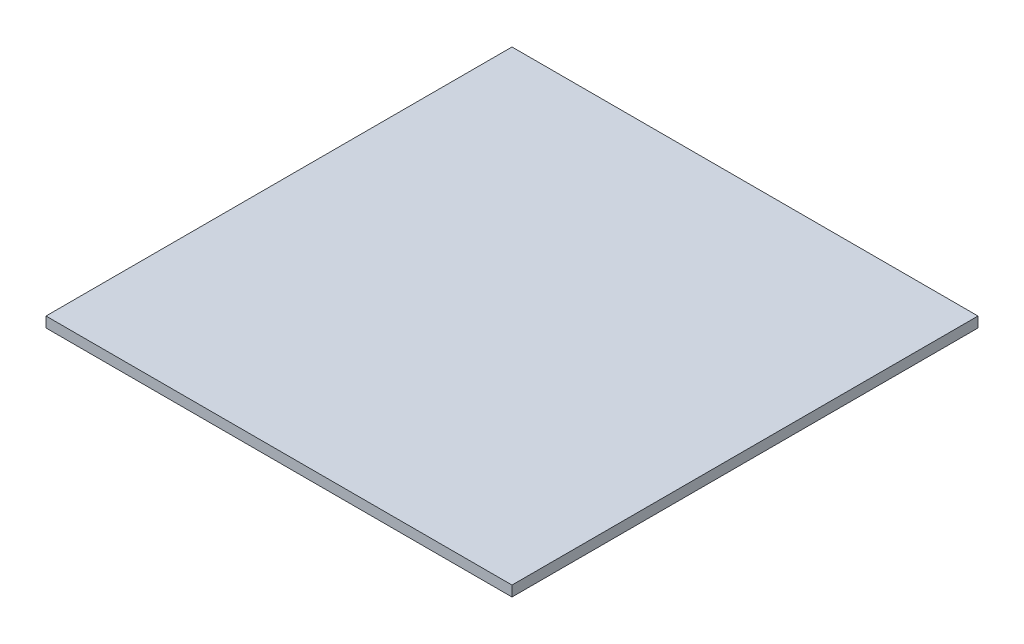
ISO-10303-21;
HEADER;
FILE_DESCRIPTION(('STEP AP214'),'2;1');
FILE_NAME('part.step','',(''),(''),'','','');
FILE_SCHEMA(('AUTOMOTIVE_DESIGN { 1 0 10303 214 1 1 1 1 }'));
ENDSEC;
DATA;
#1=APPLICATION_CONTEXT('core data for automotive mechanical design processes');
#2=APPLICATION_PROTOCOL_DEFINITION('international standard','automotive_design',2000,#1);
#3=PRODUCT_CONTEXT('',#1,'mechanical');
#4=PRODUCT('Part','Part','',(#3));
#5=PRODUCT_RELATED_PRODUCT_CATEGORY('part','',(#4));
#6=PRODUCT_DEFINITION_FORMATION('','',#4);
#7=PRODUCT_DEFINITION_CONTEXT('part definition',#1,'design');
#8=PRODUCT_DEFINITION('design','',#6,#7);
#9=PRODUCT_DEFINITION_SHAPE('','',#8);
#10=(LENGTH_UNIT() NAMED_UNIT(*) SI_UNIT(.MILLI.,.METRE.));
#11=(NAMED_UNIT(*) PLANE_ANGLE_UNIT() SI_UNIT($,.RADIAN.));
#12=(NAMED_UNIT(*) SI_UNIT($,.STERADIAN.) SOLID_ANGLE_UNIT());
#13=UNCERTAINTY_MEASURE_WITH_UNIT(LENGTH_MEASURE(1.E-05),#10,'distance_accuracy_value','');
#14=(GEOMETRIC_REPRESENTATION_CONTEXT(3) GLOBAL_UNCERTAINTY_ASSIGNED_CONTEXT((#13)) GLOBAL_UNIT_ASSIGNED_CONTEXT((#10,
#11,#12)) REPRESENTATION_CONTEXT('',''));
#15=CARTESIAN_POINT('',(0.,0.,0.));
#16=DIRECTION('',(0.,0.,1.));
#17=DIRECTION('',(1.,0.,0.));
#18=AXIS2_PLACEMENT_3D('',#15,#16,#17);
#19=CARTESIAN_POINT('',(-325.,0.,-325.));
#20=DIRECTION('',(0.,1.,0.));
#21=DIRECTION('',(1.,0.,0.));
#22=AXIS2_PLACEMENT_3D('',#19,#20,#21);
#23=PLANE('',#22);
#24=DIRECTION('',(-1.,0.,0.));
#25=VECTOR('',#24,1.);
#26=CARTESIAN_POINT('',(-162.5,0.,-650.));
#27=LINE('',#26,#25);
#28=CARTESIAN_POINT('',(0.,0.,-650.));
#29=VERTEX_POINT('',#28);
#30=CARTESIAN_POINT('',(-650.,0.,-650.));
#31=VERTEX_POINT('',#30);
#32=EDGE_CURVE('E342',#29,#31,#27,.T.);
#33=ORIENTED_EDGE('',*,*,#32,.F.);
#34=DIRECTION('',(0.,0.,-1.));
#35=VECTOR('',#34,1.);
#36=CARTESIAN_POINT('',(0.,0.,-162.5));
#37=LINE('',#36,#35);
#38=CARTESIAN_POINT('',(0.,0.,0.));
#39=VERTEX_POINT('',#38);
#40=EDGE_CURVE('E38',#39,#29,#37,.T.);
#41=ORIENTED_EDGE('',*,*,#40,.F.);
#42=DIRECTION('',(1.,0.,0.));
#43=VECTOR('',#42,1.);
#44=CARTESIAN_POINT('',(-487.5,0.,0.));
#45=LINE('',#44,#43);
#46=CARTESIAN_POINT('',(-650.,0.,0.));
#47=VERTEX_POINT('',#46);
#48=EDGE_CURVE('E424',#47,#39,#45,.T.);
#49=ORIENTED_EDGE('',*,*,#48,.F.);
#50=DIRECTION('',(0.,0.,1.));
#51=VECTOR('',#50,1.);
#52=CARTESIAN_POINT('',(-650.,0.,-487.5));
#53=LINE('',#52,#51);
#54=EDGE_CURVE('E352',#31,#47,#53,.T.);
#55=ORIENTED_EDGE('',*,*,#54,.F.);
#56=EDGE_LOOP('',(#33,#41,#49,#55));
#57=FACE_BOUND('',#56,.T.);
#58=DIRECTION('',(-1.,0.,0.));
#59=VECTOR('',#58,1.);
#60=CARTESIAN_POINT('',(-397.5,0.,-180.));
#61=LINE('',#60,#59);
#62=CARTESIAN_POINT('',(-430.,0.,-180.));
#63=VERTEX_POINT('',#62);
#64=CARTESIAN_POINT('',(-470.,0.,-180.));
#65=VERTEX_POINT('',#64);
#66=EDGE_CURVE('E369',#63,#65,#61,.T.);
#67=ORIENTED_EDGE('',*,*,#66,.F.);
#68=DIRECTION('',(0.,0.,1.));
#69=VECTOR('',#68,1.);
#70=CARTESIAN_POINT('',(-430.,0.,-252.5));
#71=LINE('',#70,#69);
#72=CARTESIAN_POINT('',(-430.,0.,-220.));
#73=VERTEX_POINT('',#72);
#74=EDGE_CURVE('E363',#73,#63,#71,.T.);
#75=ORIENTED_EDGE('',*,*,#74,.F.);
#76=DIRECTION('',(1.,0.,0.));
#77=VECTOR('',#76,1.);
#78=CARTESIAN_POINT('',(-377.5,0.,-220.));
#79=LINE('',#78,#77);
#80=CARTESIAN_POINT('',(-470.,0.,-220.));
#81=VERTEX_POINT('',#80);
#82=EDGE_CURVE('E321',#81,#73,#79,.T.);
#83=ORIENTED_EDGE('',*,*,#82,.F.);
#84=DIRECTION('',(0.,0.,-1.));
#85=VECTOR('',#84,1.);
#86=CARTESIAN_POINT('',(-470.,0.,-272.5));
#87=LINE('',#86,#85);
#88=EDGE_CURVE('E279',#65,#81,#87,.T.);
#89=ORIENTED_EDGE('',*,*,#88,.F.);
#90=EDGE_LOOP('',(#67,#75,#83,#89));
#91=FACE_BOUND('',#90,.T.);
#92=DIRECTION('',(0.,0.,1.));
#93=VECTOR('',#92,1.);
#94=CARTESIAN_POINT('',(-270.,0.,-325.));
#95=LINE('',#94,#93);
#96=CARTESIAN_POINT('',(-270.,0.,-330.95));
#97=VERTEX_POINT('',#96);
#98=CARTESIAN_POINT('',(-270.,0.,-319.05));
#99=VERTEX_POINT('',#98);
#100=EDGE_CURVE('E367',#97,#99,#95,.T.);
#101=ORIENTED_EDGE('',*,*,#100,.F.);
#102=DIRECTION('',(-1.,0.,0.));
#103=VECTOR('',#102,1.);
#104=CARTESIAN_POINT('',(-325.,0.,-330.95));
#105=LINE('',#104,#103);
#106=CARTESIAN_POINT('',(-370.,0.,-330.95));
#107=VERTEX_POINT('',#106);
#108=EDGE_CURVE('E10',#97,#107,#105,.T.);
#109=ORIENTED_EDGE('',*,*,#108,.T.);
#110=DIRECTION('',(0.,0.,-1.));
#111=VECTOR('',#110,1.);
#112=CARTESIAN_POINT('',(-370.,0.,-325.));
#113=LINE('',#112,#111);
#114=CARTESIAN_POINT('',(-370.,0.,-319.05));
#115=VERTEX_POINT('',#114);
#116=EDGE_CURVE('E285',#115,#107,#113,.T.);
#117=ORIENTED_EDGE('',*,*,#116,.F.);
#118=DIRECTION('',(1.,0.,0.));
#119=VECTOR('',#118,1.);
#120=CARTESIAN_POINT('',(-325.,0.,-319.05));
#121=LINE('',#120,#119);
#122=EDGE_CURVE('E25',#115,#99,#121,.T.);
#123=ORIENTED_EDGE('',*,*,#122,.T.);
#124=EDGE_LOOP('',(#101,#109,#117,#123));
#125=FACE_BOUND('',#124,.T.);
#126=DIRECTION('',(-0.707106781186548,0.,-0.707106781186548));
#127=VECTOR('',#126,1.);
#128=CARTESIAN_POINT('',(-580.557539631927,0.,-69.4424603680731));
#129=LINE('',#128,#127);
#130=CARTESIAN_POINT('',(-576.350254283867,0.,-65.2351750200131));
#131=VERTEX_POINT('',#130);
#132=CARTESIAN_POINT('',(-584.764824979987,0.,-73.649745716133));
#133=VERTEX_POINT('',#132);
#134=EDGE_CURVE('E442',#131,#133,#129,.T.);
#135=ORIENTED_EDGE('',*,*,#134,.F.);
#136=DIRECTION('',(0.707106781186548,0.,-0.707106781186548));
#137=VECTOR('',#136,1.);
#138=CARTESIAN_POINT('',(-537.459381318607,0.,-104.126047985273));
#139=LINE('',#138,#137);
#140=CARTESIAN_POINT('',(-505.639576165212,0.,-135.945853138668));
#141=VERTEX_POINT('',#140);
#142=EDGE_CURVE('E350',#131,#141,#139,.T.);
#143=ORIENTED_EDGE('',*,*,#142,.T.);
#144=DIRECTION('',(0.707106781186548,0.,0.707106781186548));
#145=VECTOR('',#144,1.);
#146=CARTESIAN_POINT('',(-509.846861513272,0.,-140.153138486728));
#147=LINE('',#146,#145);
#148=CARTESIAN_POINT('',(-514.054146861332,0.,-144.360423834788));
#149=VERTEX_POINT('',#148);
#150=EDGE_CURVE('E299',#149,#141,#147,.T.);
#151=ORIENTED_EDGE('',*,*,#150,.F.);
#152=DIRECTION('',(-0.707106781186548,0.,0.707106781186548));
#153=VECTOR('',#152,1.);
#154=CARTESIAN_POINT('',(-545.873952014727,0.,-112.540618681393));
#155=LINE('',#154,#153);
#156=EDGE_CURVE('E338',#149,#133,#155,.T.);
#157=ORIENTED_EDGE('',*,*,#156,.T.);
#158=EDGE_LOOP('',(#135,#143,#151,#157));
#159=FACE_BOUND('',#158,.T.);
#160=DIRECTION('',(-1.,0.,0.));
#161=VECTOR('',#160,1.);
#162=CARTESIAN_POINT('',(-325.,0.,-53.3333333333333));
#163=LINE('',#162,#161);
#164=CARTESIAN_POINT('',(-319.05,0.,-53.3333333333334));
#165=VERTEX_POINT('',#164);
#166=CARTESIAN_POINT('',(-330.95,0.,-53.3333333333334));
#167=VERTEX_POINT('',#166);
#168=EDGE_CURVE('E446',#165,#167,#163,.T.);
#169=ORIENTED_EDGE('',*,*,#168,.F.);
#170=DIRECTION('',(0.,0.,-1.));
#171=VECTOR('',#170,1.);
#172=CARTESIAN_POINT('',(-319.05,0.,-108.333333333333));
#173=LINE('',#172,#171);
#174=CARTESIAN_POINT('',(-319.05,0.,-153.333333333333));
#175=VERTEX_POINT('',#174);
#176=EDGE_CURVE('E334',#165,#175,#173,.T.);
#177=ORIENTED_EDGE('',*,*,#176,.T.);
#178=DIRECTION('',(1.,0.,0.));
#179=VECTOR('',#178,1.);
#180=CARTESIAN_POINT('',(-325.,0.,-153.333333333333));
#181=LINE('',#180,#179);
#182=CARTESIAN_POINT('',(-330.95,0.,-153.333333333333));
#183=VERTEX_POINT('',#182);
#184=EDGE_CURVE('E313',#183,#175,#181,.T.);
#185=ORIENTED_EDGE('',*,*,#184,.F.);
#186=DIRECTION('',(0.,0.,1.));
#187=VECTOR('',#186,1.);
#188=CARTESIAN_POINT('',(-330.95,0.,-108.333333333333));
#189=LINE('',#188,#187);
#190=EDGE_CURVE('E308',#183,#167,#189,.T.);
#191=ORIENTED_EDGE('',*,*,#190,.T.);
#192=EDGE_LOOP('',(#169,#177,#185,#191));
#193=FACE_BOUND('',#192,.T.);
#194=DIRECTION('',(-1.,0.,0.));
#195=VECTOR('',#194,1.);
#196=CARTESIAN_POINT('',(-216.666666666667,0.,-53.3333333333333));
#197=LINE('',#196,#195);
#198=CARTESIAN_POINT('',(-102.383333333333,0.,-53.3333333333333));
#199=VERTEX_POINT('',#198);
#200=CARTESIAN_POINT('',(-114.283333333333,0.,-53.3333333333333));
#201=VERTEX_POINT('',#200);
#202=EDGE_CURVE('E407',#199,#201,#197,.T.);
#203=ORIENTED_EDGE('',*,*,#202,.F.);
#204=DIRECTION('',(0.,0.,-1.));
#205=VECTOR('',#204,1.);
#206=CARTESIAN_POINT('',(-102.383333333333,0.,-108.333333333333));
#207=LINE('',#206,#205);
#208=CARTESIAN_POINT('',(-102.383333333333,0.,-153.333333333333));
#209=VERTEX_POINT('',#208);
#210=EDGE_CURVE('E304',#199,#209,#207,.T.);
#211=ORIENTED_EDGE('',*,*,#210,.T.);
#212=DIRECTION('',(1.,0.,0.));
#213=VECTOR('',#212,1.);
#214=CARTESIAN_POINT('',(-216.666666666667,0.,-153.333333333333));
#215=LINE('',#214,#213);
#216=CARTESIAN_POINT('',(-114.283333333333,0.,-153.333333333333));
#217=VERTEX_POINT('',#216);
#218=EDGE_CURVE('E19',#217,#209,#215,.T.);
#219=ORIENTED_EDGE('',*,*,#218,.F.);
#220=DIRECTION('',(0.,0.,1.));
#221=VECTOR('',#220,1.);
#222=CARTESIAN_POINT('',(-114.283333333333,0.,-108.333333333333));
#223=LINE('',#222,#221);
#224=EDGE_CURVE('E273',#217,#201,#223,.T.);
#225=ORIENTED_EDGE('',*,*,#224,.T.);
#226=EDGE_LOOP('',(#203,#211,#219,#225));
#227=FACE_BOUND('',#226,.T.);
#228=DIRECTION('',(1.,0.,0.));
#229=VECTOR('',#228,1.);
#230=CARTESIAN_POINT('',(-216.666666666667,0.,-380.));
#231=LINE('',#230,#229);
#232=CARTESIAN_POINT('',(-114.283333333333,0.,-380.));
#233=VERTEX_POINT('',#232);
#234=CARTESIAN_POINT('',(-102.383333333333,0.,-380.));
#235=VERTEX_POINT('',#234);
#236=EDGE_CURVE('E318',#233,#235,#231,.T.);
#237=ORIENTED_EDGE('',*,*,#236,.F.);
#238=DIRECTION('',(0.,0.,1.));
#239=VECTOR('',#238,1.);
#240=CARTESIAN_POINT('',(-114.283333333333,0.,-325.));
#241=LINE('',#240,#239);
#242=CARTESIAN_POINT('',(-114.283333333333,0.,-280.));
#243=VERTEX_POINT('',#242);
#244=EDGE_CURVE('E269',#233,#243,#241,.T.);
#245=ORIENTED_EDGE('',*,*,#244,.T.);
#246=DIRECTION('',(-1.,0.,0.));
#247=VECTOR('',#246,1.);
#248=CARTESIAN_POINT('',(-216.666666666667,0.,-280.));
#249=LINE('',#248,#247);
#250=CARTESIAN_POINT('',(-102.383333333333,0.,-280.));
#251=VERTEX_POINT('',#250);
#252=EDGE_CURVE('E362',#251,#243,#249,.T.);
#253=ORIENTED_EDGE('',*,*,#252,.F.);
#254=DIRECTION('',(0.,0.,-1.));
#255=VECTOR('',#254,1.);
#256=CARTESIAN_POINT('',(-102.383333333333,0.,-325.));
#257=LINE('',#256,#255);
#258=EDGE_CURVE('E274',#251,#235,#257,.T.);
#259=ORIENTED_EDGE('',*,*,#258,.T.);
#260=EDGE_LOOP('',(#237,#245,#253,#259));
#261=FACE_BOUND('',#260,.T.);
#262=DIRECTION('',(1.,0.,0.));
#263=VECTOR('',#262,1.);
#264=CARTESIAN_POINT('',(-325.,0.,-596.666666666667));
#265=LINE('',#264,#263);
#266=CARTESIAN_POINT('',(-330.95,0.,-596.666666666667));
#267=VERTEX_POINT('',#266);
#268=CARTESIAN_POINT('',(-319.05,0.,-596.666666666667));
#269=VERTEX_POINT('',#268);
#270=EDGE_CURVE('E314',#267,#269,#265,.T.);
#271=ORIENTED_EDGE('',*,*,#270,.F.);
#272=DIRECTION('',(0.,0.,1.));
#273=VECTOR('',#272,1.);
#274=CARTESIAN_POINT('',(-330.95,0.,-541.666666666667));
#275=LINE('',#274,#273);
#276=CARTESIAN_POINT('',(-330.95,0.,-496.666666666667));
#277=VERTEX_POINT('',#276);
#278=EDGE_CURVE('E278',#267,#277,#275,.T.);
#279=ORIENTED_EDGE('',*,*,#278,.T.);
#280=DIRECTION('',(-1.,0.,0.));
#281=VECTOR('',#280,1.);
#282=CARTESIAN_POINT('',(-325.,0.,-496.666666666667));
#283=LINE('',#282,#281);
#284=CARTESIAN_POINT('',(-319.05,0.,-496.666666666667));
#285=VERTEX_POINT('',#284);
#286=EDGE_CURVE('E294',#285,#277,#283,.T.);
#287=ORIENTED_EDGE('',*,*,#286,.F.);
#288=DIRECTION('',(0.,0.,-1.));
#289=VECTOR('',#288,1.);
#290=CARTESIAN_POINT('',(-319.05,0.,-541.666666666667));
#291=LINE('',#290,#289);
#292=EDGE_CURVE('E267',#285,#269,#291,.T.);
#293=ORIENTED_EDGE('',*,*,#292,.T.);
#294=EDGE_LOOP('',(#271,#279,#287,#293));
#295=FACE_BOUND('',#294,.T.);
#296=DIRECTION('',(0.707106781186548,0.,0.707106781186548));
#297=VECTOR('',#296,1.);
#298=CARTESIAN_POINT('',(-69.4424603680732,0.,-580.557539631927));
#299=LINE('',#298,#297);
#300=CARTESIAN_POINT('',(-73.6497457161331,0.,-584.764824979987));
#301=VERTEX_POINT('',#300);
#302=CARTESIAN_POINT('',(-65.2351750200132,0.,-576.350254283867));
#303=VERTEX_POINT('',#302);
#304=EDGE_CURVE('E317',#301,#303,#299,.T.);
#305=ORIENTED_EDGE('',*,*,#304,.F.);
#306=DIRECTION('',(-0.707106781186548,0.,0.707106781186548));
#307=VECTOR('',#306,1.);
#308=CARTESIAN_POINT('',(-112.540618681393,0.,-545.873952014727));
#309=LINE('',#308,#307);
#310=CARTESIAN_POINT('',(-144.360423834788,0.,-514.054146861332));
#311=VERTEX_POINT('',#310);
#312=EDGE_CURVE('E264',#301,#311,#309,.T.);
#313=ORIENTED_EDGE('',*,*,#312,.T.);
#314=DIRECTION('',(-0.707106781186548,0.,-0.707106781186548));
#315=VECTOR('',#314,1.);
#316=CARTESIAN_POINT('',(-140.153138486728,0.,-509.846861513272));
#317=LINE('',#316,#315);
#318=CARTESIAN_POINT('',(-135.945853138668,0.,-505.639576165212));
#319=VERTEX_POINT('',#318);
#320=EDGE_CURVE('E484',#319,#311,#317,.T.);
#321=ORIENTED_EDGE('',*,*,#320,.F.);
#322=DIRECTION('',(0.707106781186548,0.,-0.707106781186548));
#323=VECTOR('',#322,1.);
#324=CARTESIAN_POINT('',(-104.126047985273,0.,-537.459381318607));
#325=LINE('',#324,#323);
#326=EDGE_CURVE('E268',#319,#303,#325,.T.);
#327=ORIENTED_EDGE('',*,*,#326,.T.);
#328=EDGE_LOOP('',(#305,#313,#321,#327));
#329=FACE_BOUND('',#328,.T.);
#330=DIRECTION('',(1.,0.,0.));
#331=VECTOR('',#330,1.);
#332=CARTESIAN_POINT('',(-541.666666666667,0.,-319.05));
#333=LINE('',#332,#331);
#334=CARTESIAN_POINT('',(-596.666666666667,0.,-319.05));
#335=VERTEX_POINT('',#334);
#336=CARTESIAN_POINT('',(-496.666666666667,-1.4210854715202E-13,-319.05));
#337=VERTEX_POINT('',#336);
#338=EDGE_CURVE('E245',#335,#337,#333,.T.);
#339=ORIENTED_EDGE('',*,*,#338,.T.);
#340=DIRECTION('',(0.,0.,1.));
#341=VECTOR('',#340,1.);
#342=CARTESIAN_POINT('',(-496.666666666667,0.,-325.));
#343=LINE('',#342,#341);
#344=CARTESIAN_POINT('',(-496.666666666667,0.,-330.95));
#345=VERTEX_POINT('',#344);
#346=EDGE_CURVE('E240',#345,#337,#343,.T.);
#347=ORIENTED_EDGE('',*,*,#346,.F.);
#348=DIRECTION('',(-1.,0.,0.));
#349=VECTOR('',#348,1.);
#350=CARTESIAN_POINT('',(-541.666666666667,0.,-330.95));
#351=LINE('',#350,#349);
#352=CARTESIAN_POINT('',(-596.666666666667,0.,-330.95));
#353=VERTEX_POINT('',#352);
#354=EDGE_CURVE('E238',#345,#353,#351,.T.);
#355=ORIENTED_EDGE('',*,*,#354,.T.);
#356=DIRECTION('',(0.,0.,-1.));
#357=VECTOR('',#356,1.);
#358=CARTESIAN_POINT('',(-596.666666666667,0.,-325.));
#359=LINE('',#358,#357);
#360=EDGE_CURVE('E225',#335,#353,#359,.T.);
#361=ORIENTED_EDGE('',*,*,#360,.F.);
#362=EDGE_LOOP('',(#339,#347,#355,#361));
#363=FACE_BOUND('',#362,.T.);
#364=DIRECTION('',(1.,0.,0.));
#365=VECTOR('',#364,1.);
#366=CARTESIAN_POINT('',(-541.666666666667,0.,-535.716666666667));
#367=LINE('',#366,#365);
#368=CARTESIAN_POINT('',(-596.666666666667,0.,-535.716666666667));
#369=VERTEX_POINT('',#368);
#370=CARTESIAN_POINT('',(-496.666666666667,0.,-535.716666666667));
#371=VERTEX_POINT('',#370);
#372=EDGE_CURVE('E246',#369,#371,#367,.T.);
#373=ORIENTED_EDGE('',*,*,#372,.T.);
#374=DIRECTION('',(0.,0.,1.));
#375=VECTOR('',#374,1.);
#376=CARTESIAN_POINT('',(-496.666666666667,0.,-433.333333333333));
#377=LINE('',#376,#375);
#378=CARTESIAN_POINT('',(-496.666666666667,-2.1316282072803E-13,-547.616666666667));
#379=VERTEX_POINT('',#378);
#380=EDGE_CURVE('E387',#379,#371,#377,.T.);
#381=ORIENTED_EDGE('',*,*,#380,.F.);
#382=DIRECTION('',(-1.,0.,0.));
#383=VECTOR('',#382,1.);
#384=CARTESIAN_POINT('',(-541.666666666667,0.,-547.616666666667));
#385=LINE('',#384,#383);
#386=CARTESIAN_POINT('',(-596.666666666667,0.,-547.616666666667));
#387=VERTEX_POINT('',#386);
#388=EDGE_CURVE('E389',#379,#387,#385,.T.);
#389=ORIENTED_EDGE('',*,*,#388,.T.);
#390=DIRECTION('',(0.,0.,-1.));
#391=VECTOR('',#390,1.);
#392=CARTESIAN_POINT('',(-596.666666666667,0.,-433.333333333333));
#393=LINE('',#392,#391);
#394=EDGE_CURVE('E346',#369,#387,#393,.T.);
#395=ORIENTED_EDGE('',*,*,#394,.F.);
#396=EDGE_LOOP('',(#373,#381,#389,#395));
#397=FACE_BOUND('',#396,.T.);
#398=ADVANCED_FACE('F15',(#57,#91,#125,#159,#193,#227,#261,#295,#329,#363,#397),#23,.F.);
#399=CARTESIAN_POINT('',(-496.666666666667,-2.1316282072803E-13,-541.666666666667));
#400=DIRECTION('',(1.,0.,0.));
#401=DIRECTION('',(0.,-1.,0.));
#402=AXIS2_PLACEMENT_3D('',#399,#400,#401);
#403=PLANE('',#402);
#404=ORIENTED_EDGE('',*,*,#380,.T.);
#405=CARTESIAN_POINT('',(-496.666666666667,-2.1316282072803E-13,-541.666666666667));
#406=DIRECTION('',(1.,0.,0.));
#407=DIRECTION('',(0.,0.,-1.));
#408=AXIS2_PLACEMENT_3D('',#405,#406,#407);
#409=CIRCLE('',#408,5.95);
#410=EDGE_CURVE('E472',#379,#371,#409,.T.);
#411=ORIENTED_EDGE('',*,*,#410,.F.);
#412=EDGE_LOOP('',(#404,#411));
#413=FACE_BOUND('',#412,.T.);
#414=ADVANCED_FACE('F564',(#413),#403,.F.);
#415=CARTESIAN_POINT('',(-496.666666666667,-1.4210854715202E-13,-325.));
#416=DIRECTION('',(1.,0.,0.));
#417=DIRECTION('',(0.,-1.,0.));
#418=AXIS2_PLACEMENT_3D('',#415,#416,#417);
#419=PLANE('',#418);
#420=ORIENTED_EDGE('',*,*,#346,.T.);
#421=CARTESIAN_POINT('',(-496.666666666667,-1.4210854715202E-13,-325.));
#422=DIRECTION('',(1.,0.,0.));
#423=DIRECTION('',(0.,0.,1.));
#424=AXIS2_PLACEMENT_3D('',#421,#422,#423);
#425=CIRCLE('',#424,5.95);
#426=EDGE_CURVE('E234',#345,#337,#425,.T.);
#427=ORIENTED_EDGE('',*,*,#426,.F.);
#428=EDGE_LOOP('',(#420,#427));
#429=FACE_BOUND('',#428,.T.);
#430=ADVANCED_FACE('F570',(#429),#419,.F.);
#431=CARTESIAN_POINT('',(-69.4424603680731,3.50275364269237E-13,-580.557539631927));
#432=DIRECTION('',(0.707106781186548,0.,-0.707106781186548));
#433=DIRECTION('',(0.,-1.,0.));
#434=AXIS2_PLACEMENT_3D('',#431,#432,#433);
#435=PLANE('',#434);
#436=ORIENTED_EDGE('',*,*,#304,.T.);
#437=CARTESIAN_POINT('',(-69.4424603680731,3.50275364269237E-13,-580.557539631927));
#438=DIRECTION('',(0.707106781186548,0.,-0.707106781186547));
#439=DIRECTION('',(0.5,0.707106781186547,0.5));
#440=AXIS2_PLACEMENT_3D('',#437,#438,#439);
#441=CIRCLE('',#440,5.95);
#442=EDGE_CURVE('E327',#301,#303,#441,.T.);
#443=ORIENTED_EDGE('',*,*,#442,.F.);
#444=EDGE_LOOP('',(#436,#443));
#445=FACE_BOUND('',#444,.T.);
#446=ADVANCED_FACE('F575',(#445),#435,.F.);
#447=CARTESIAN_POINT('',(-325.,1.3988810110277E-13,-596.666666666667));
#448=DIRECTION('',(0.,0.,-1.));
#449=DIRECTION('',(0.,-1.,0.));
#450=AXIS2_PLACEMENT_3D('',#447,#448,#449);
#451=PLANE('',#450);
#452=ORIENTED_EDGE('',*,*,#270,.T.);
#453=CARTESIAN_POINT('',(-325.,1.3988810110277E-13,-596.666666666667));
#454=DIRECTION('',(0.,0.,-1.));
#455=DIRECTION('',(0.,1.,0.));
#456=AXIS2_PLACEMENT_3D('',#453,#454,#455);
#457=CIRCLE('',#456,5.95);
#458=EDGE_CURVE('E476',#267,#269,#457,.T.);
#459=ORIENTED_EDGE('',*,*,#458,.F.);
#460=EDGE_LOOP('',(#452,#459));
#461=FACE_BOUND('',#460,.T.);
#462=ADVANCED_FACE('F611',(#461),#451,.F.);
#463=CARTESIAN_POINT('',(-108.333333333333,0.,-380.));
#464=DIRECTION('',(0.,0.,-1.));
#465=DIRECTION('',(0.,-1.,0.));
#466=AXIS2_PLACEMENT_3D('',#463,#464,#465);
#467=PLANE('',#466);
#468=ORIENTED_EDGE('',*,*,#236,.T.);
#469=CARTESIAN_POINT('',(-108.333333333333,0.,-380.));
#470=DIRECTION('',(0.,0.,-1.));
#471=DIRECTION('',(0.,1.,0.));
#472=AXIS2_PLACEMENT_3D('',#469,#470,#471);
#473=CIRCLE('',#472,5.95);
#474=EDGE_CURVE('E288',#233,#235,#473,.T.);
#475=ORIENTED_EDGE('',*,*,#474,.F.);
#476=EDGE_LOOP('',(#468,#475));
#477=FACE_BOUND('',#476,.T.);
#478=ADVANCED_FACE('F404',(#477),#467,.F.);
#479=CARTESIAN_POINT('',(-108.333333333333,0.,-53.3333333333333));
#480=DIRECTION('',(0.,0.,1.));
#481=DIRECTION('',(0.,-1.,0.));
#482=AXIS2_PLACEMENT_3D('',#479,#480,#481);
#483=PLANE('',#482);
#484=ORIENTED_EDGE('',*,*,#202,.T.);
#485=CARTESIAN_POINT('',(-108.333333333333,0.,-53.3333333333333));
#486=DIRECTION('',(0.,0.,1.));
#487=DIRECTION('',(0.,1.,0.));
#488=AXIS2_PLACEMENT_3D('',#485,#486,#487);
#489=CIRCLE('',#488,5.95);
#490=EDGE_CURVE('E379',#199,#201,#489,.T.);
#491=ORIENTED_EDGE('',*,*,#490,.F.);
#492=EDGE_LOOP('',(#484,#491));
#493=FACE_BOUND('',#492,.T.);
#494=ADVANCED_FACE('F604',(#493),#483,.F.);
#495=CARTESIAN_POINT('',(-325.,0.,-53.3333333333333));
#496=DIRECTION('',(0.,0.,1.));
#497=DIRECTION('',(0.,-1.,0.));
#498=AXIS2_PLACEMENT_3D('',#495,#496,#497);
#499=PLANE('',#498);
#500=ORIENTED_EDGE('',*,*,#168,.T.);
#501=CARTESIAN_POINT('',(-325.,0.,-53.3333333333333));
#502=DIRECTION('',(0.,0.,1.));
#503=DIRECTION('',(0.,1.,0.));
#504=AXIS2_PLACEMENT_3D('',#501,#502,#503);
#505=CIRCLE('',#504,5.95);
#506=EDGE_CURVE('E309',#165,#167,#505,.T.);
#507=ORIENTED_EDGE('',*,*,#506,.F.);
#508=EDGE_LOOP('',(#500,#507));
#509=FACE_BOUND('',#508,.T.);
#510=ADVANCED_FACE('F539',(#509),#499,.F.);
#511=CARTESIAN_POINT('',(-580.557539631927,0.,-69.442460368073));
#512=DIRECTION('',(-0.707106781186548,0.,0.707106781186548));
#513=DIRECTION('',(0.,1.,0.));
#514=AXIS2_PLACEMENT_3D('',#511,#512,#513);
#515=PLANE('',#514);
#516=ORIENTED_EDGE('',*,*,#134,.T.);
#517=CARTESIAN_POINT('',(-580.557539631927,0.,-69.442460368073));
#518=DIRECTION('',(-0.707106781186548,0.,0.707106781186547));
#519=DIRECTION('',(0.5,0.707106781186547,0.5));
#520=AXIS2_PLACEMENT_3D('',#517,#518,#519);
#521=CIRCLE('',#520,5.95);
#522=EDGE_CURVE('E303',#131,#133,#521,.T.);
#523=ORIENTED_EDGE('',*,*,#522,.F.);
#524=EDGE_LOOP('',(#516,#523));
#525=FACE_BOUND('',#524,.T.);
#526=ADVANCED_FACE('F594',(#525),#515,.F.);
#527=CARTESIAN_POINT('',(-270.,0.,-325.));
#528=DIRECTION('',(1.,0.,0.));
#529=DIRECTION('',(0.,-1.,0.));
#530=AXIS2_PLACEMENT_3D('',#527,#528,#529);
#531=PLANE('',#530);
#532=ORIENTED_EDGE('',*,*,#100,.T.);
#533=CARTESIAN_POINT('',(-270.,0.,-325.));
#534=DIRECTION('',(1.,0.,0.));
#535=DIRECTION('',(0.,0.,1.));
#536=AXIS2_PLACEMENT_3D('',#533,#534,#535);
#537=CIRCLE('',#536,5.95);
#538=EDGE_CURVE('E290',#97,#99,#537,.T.);
#539=ORIENTED_EDGE('',*,*,#538,.F.);
#540=EDGE_LOOP('',(#532,#539));
#541=FACE_BOUND('',#540,.T.);
#542=ADVANCED_FACE('F597',(#541),#531,.F.);
#543=CARTESIAN_POINT('',(-430.,-0.5,-180.));
#544=DIRECTION('',(1.,0.,0.));
#545=DIRECTION('',(0.,1.,0.));
#546=AXIS2_PLACEMENT_3D('',#543,#544,#545);
#547=PLANE('',#546);
#548=ORIENTED_EDGE('',*,*,#74,.T.);
#549=DIRECTION('',(0.,1.,0.));
#550=VECTOR('',#549,1.);
#551=CARTESIAN_POINT('',(-430.,-0.5,-180.));
#552=LINE('',#551,#550);
#553=CARTESIAN_POINT('',(-430.,4.5,-180.));
#554=VERTEX_POINT('',#553);
#555=EDGE_CURVE('E368',#63,#554,#552,.T.);
#556=ORIENTED_EDGE('',*,*,#555,.T.);
#557=DIRECTION('',(0.,0.,-1.));
#558=VECTOR('',#557,1.);
#559=CARTESIAN_POINT('',(-430.,4.5,-220.));
#560=LINE('',#559,#558);
#561=CARTESIAN_POINT('',(-430.,4.5,-220.));
#562=VERTEX_POINT('',#561);
#563=EDGE_CURVE('E373',#554,#562,#560,.T.);
#564=ORIENTED_EDGE('',*,*,#563,.T.);
#565=DIRECTION('',(0.,1.,0.));
#566=VECTOR('',#565,1.);
#567=CARTESIAN_POINT('',(-430.,-0.5,-220.));
#568=LINE('',#567,#566);
#569=EDGE_CURVE('E257',#73,#562,#568,.T.);
#570=ORIENTED_EDGE('',*,*,#569,.F.);
#571=EDGE_LOOP('',(#548,#556,#564,#570));
#572=FACE_BOUND('',#571,.T.);
#573=ADVANCED_FACE('F608',(#572),#547,.F.);
#574=CARTESIAN_POINT('',(-470.,-0.5,-180.));
#575=DIRECTION('',(0.,0.,1.));
#576=DIRECTION('',(1.,0.,0.));
#577=AXIS2_PLACEMENT_3D('',#574,#575,#576);
#578=PLANE('',#577);
#579=ORIENTED_EDGE('',*,*,#66,.T.);
#580=DIRECTION('',(0.,1.,0.));
#581=VECTOR('',#580,1.);
#582=CARTESIAN_POINT('',(-470.,-0.5,-180.));
#583=LINE('',#582,#581);
#584=CARTESIAN_POINT('',(-470.,4.5,-180.));
#585=VERTEX_POINT('',#584);
#586=EDGE_CURVE('E374',#65,#585,#583,.T.);
#587=ORIENTED_EDGE('',*,*,#586,.T.);
#588=DIRECTION('',(1.,0.,0.));
#589=VECTOR('',#588,1.);
#590=CARTESIAN_POINT('',(-430.,4.5,-180.));
#591=LINE('',#590,#589);
#592=EDGE_CURVE('E356',#585,#554,#591,.T.);
#593=ORIENTED_EDGE('',*,*,#592,.T.);
#594=ORIENTED_EDGE('',*,*,#555,.F.);
#595=EDGE_LOOP('',(#579,#587,#593,#594));
#596=FACE_BOUND('',#595,.T.);
#597=ADVANCED_FACE('F605',(#596),#578,.F.);
#598=CARTESIAN_POINT('',(-650.,0.,-650.));
#599=DIRECTION('',(-1.,0.,0.));
#600=DIRECTION('',(0.,0.,1.));
#601=AXIS2_PLACEMENT_3D('',#598,#599,#600);
#602=PLANE('',#601);
#603=ORIENTED_EDGE('',*,*,#54,.T.);
#604=DIRECTION('',(0.,1.,0.));
#605=VECTOR('',#604,1.);
#606=CARTESIAN_POINT('',(-650.,0.,0.));
#607=LINE('',#606,#605);
#608=CARTESIAN_POINT('',(-650.,14.5,0.));
#609=VERTEX_POINT('',#608);
#610=EDGE_CURVE('E357',#47,#609,#607,.T.);
#611=ORIENTED_EDGE('',*,*,#610,.T.);
#612=DIRECTION('',(0.,0.,-1.));
#613=VECTOR('',#612,1.);
#614=CARTESIAN_POINT('',(-650.,14.5,-487.5));
#615=LINE('',#614,#613);
#616=CARTESIAN_POINT('',(-650.,14.5,-650.));
#617=VERTEX_POINT('',#616);
#618=EDGE_CURVE('E383',#609,#617,#615,.T.);
#619=ORIENTED_EDGE('',*,*,#618,.T.);
#620=DIRECTION('',(0.,1.,0.));
#621=VECTOR('',#620,1.);
#622=CARTESIAN_POINT('',(-650.,0.,-650.));
#623=LINE('',#622,#621);
#624=EDGE_CURVE('E347',#31,#617,#623,.T.);
#625=ORIENTED_EDGE('',*,*,#624,.F.);
#626=EDGE_LOOP('',(#603,#611,#619,#625));
#627=FACE_BOUND('',#626,.T.);
#628=ADVANCED_FACE('F607',(#627),#602,.T.);
#629=CARTESIAN_POINT('',(-650.,0.,0.));
#630=DIRECTION('',(0.,0.,1.));
#631=DIRECTION('',(1.,0.,0.));
#632=AXIS2_PLACEMENT_3D('',#629,#630,#631);
#633=PLANE('',#632);
#634=ORIENTED_EDGE('',*,*,#48,.T.);
#635=DIRECTION('',(0.,1.,0.));
#636=VECTOR('',#635,1.);
#637=CARTESIAN_POINT('',(0.,0.,0.));
#638=LINE('',#637,#636);
#639=CARTESIAN_POINT('',(0.,14.5,0.));
#640=VERTEX_POINT('',#639);
#641=EDGE_CURVE('E427',#39,#640,#638,.T.);
#642=ORIENTED_EDGE('',*,*,#641,.T.);
#643=DIRECTION('',(-1.,0.,0.));
#644=VECTOR('',#643,1.);
#645=CARTESIAN_POINT('',(-487.5,14.5,0.));
#646=LINE('',#645,#644);
#647=EDGE_CURVE('E283',#640,#609,#646,.T.);
#648=ORIENTED_EDGE('',*,*,#647,.T.);
#649=ORIENTED_EDGE('',*,*,#610,.F.);
#650=EDGE_LOOP('',(#634,#642,#648,#649));
#651=FACE_BOUND('',#650,.T.);
#652=ADVANCED_FACE('F580',(#651),#633,.T.);
#653=CARTESIAN_POINT('',(-470.,-0.5,-220.));
#654=DIRECTION('',(-1.,0.,0.));
#655=DIRECTION('',(0.,0.,1.));
#656=AXIS2_PLACEMENT_3D('',#653,#654,#655);
#657=PLANE('',#656);
#658=ORIENTED_EDGE('',*,*,#88,.T.);
#659=DIRECTION('',(0.,1.,0.));
#660=VECTOR('',#659,1.);
#661=CARTESIAN_POINT('',(-470.,-0.5,-220.));
#662=LINE('',#661,#660);
#663=CARTESIAN_POINT('',(-470.,4.5,-220.));
#664=VERTEX_POINT('',#663);
#665=EDGE_CURVE('E284',#81,#664,#662,.T.);
#666=ORIENTED_EDGE('',*,*,#665,.T.);
#667=DIRECTION('',(0.,0.,1.));
#668=VECTOR('',#667,1.);
#669=CARTESIAN_POINT('',(-470.,4.5,-180.));
#670=LINE('',#669,#668);
#671=EDGE_CURVE('E434',#664,#585,#670,.T.);
#672=ORIENTED_EDGE('',*,*,#671,.T.);
#673=ORIENTED_EDGE('',*,*,#586,.F.);
#674=EDGE_LOOP('',(#658,#666,#672,#673));
#675=FACE_BOUND('',#674,.T.);
#676=ADVANCED_FACE('F577',(#675),#657,.F.);
#677=CARTESIAN_POINT('',(-430.,-0.5,-220.));
#678=DIRECTION('',(0.,0.,-1.));
#679=DIRECTION('',(0.,-1.,0.));
#680=AXIS2_PLACEMENT_3D('',#677,#678,#679);
#681=PLANE('',#680);
#682=ORIENTED_EDGE('',*,*,#82,.T.);
#683=ORIENTED_EDGE('',*,*,#569,.T.);
#684=DIRECTION('',(-1.,0.,0.));
#685=VECTOR('',#684,1.);
#686=CARTESIAN_POINT('',(-470.,4.5,-220.));
#687=LINE('',#686,#685);
#688=EDGE_CURVE('E250',#562,#664,#687,.T.);
#689=ORIENTED_EDGE('',*,*,#688,.T.);
#690=ORIENTED_EDGE('',*,*,#665,.F.);
#691=EDGE_LOOP('',(#682,#683,#689,#690));
#692=FACE_BOUND('',#691,.T.);
#693=ADVANCED_FACE('F579',(#692),#681,.F.);
#694=CARTESIAN_POINT('',(-450.,4.5,-200.));
#695=DIRECTION('',(0.,1.,0.));
#696=DIRECTION('',(1.,0.,0.));
#697=AXIS2_PLACEMENT_3D('',#694,#695,#696);
#698=PLANE('',#697);
#699=ORIENTED_EDGE('',*,*,#563,.F.);
#700=ORIENTED_EDGE('',*,*,#592,.F.);
#701=ORIENTED_EDGE('',*,*,#671,.F.);
#702=ORIENTED_EDGE('',*,*,#688,.F.);
#703=EDGE_LOOP('',(#699,#700,#701,#702));
#704=FACE_BOUND('',#703,.T.);
#705=ADVANCED_FACE('F638',(#704),#698,.F.);
#706=CARTESIAN_POINT('',(-541.666666666667,-1.4210854715202E-13,-325.));
#707=DIRECTION('',(1.,0.,0.));
#708=DIRECTION('',(0.,0.,1.));
#709=AXIS2_PLACEMENT_3D('',#706,#707,#708);
#710=CYLINDRICAL_SURFACE('',#709,5.95);
#711=ORIENTED_EDGE('',*,*,#338,.F.);
#712=CARTESIAN_POINT('',(-596.666666666667,-1.3988810110277E-13,-325.));
#713=DIRECTION('',(-1.,0.,0.));
#714=DIRECTION('',(0.,0.,1.));
#715=AXIS2_PLACEMENT_3D('',#712,#713,#714);
#716=CIRCLE('',#715,5.95);
#717=EDGE_CURVE('E229',#335,#353,#716,.T.);
#718=ORIENTED_EDGE('',*,*,#717,.T.);
#719=ORIENTED_EDGE('',*,*,#354,.F.);
#720=ORIENTED_EDGE('',*,*,#426,.T.);
#721=EDGE_LOOP('',(#711,#718,#719,#720));
#722=FACE_BOUND('',#721,.T.);
#723=ADVANCED_FACE('F248',(#722),#710,.F.);
#724=CARTESIAN_POINT('',(-596.666666666667,-1.3988810110277E-13,-325.));
#725=DIRECTION('',(-1.,0.,0.));
#726=DIRECTION('',(0.,0.,1.));
#727=AXIS2_PLACEMENT_3D('',#724,#725,#726);
#728=PLANE('',#727);
#729=ORIENTED_EDGE('',*,*,#360,.T.);
#730=ORIENTED_EDGE('',*,*,#717,.F.);
#731=EDGE_LOOP('',(#729,#730));
#732=FACE_BOUND('',#731,.T.);
#733=ADVANCED_FACE('F227',(#732),#728,.F.);
#734=CARTESIAN_POINT('',(-541.666666666667,-2.1316282072803E-13,-541.666666666667));
#735=DIRECTION('',(1.,0.,0.));
#736=DIRECTION('',(0.,0.,-1.));
#737=AXIS2_PLACEMENT_3D('',#734,#735,#736);
#738=CYLINDRICAL_SURFACE('',#737,5.95);
#739=ORIENTED_EDGE('',*,*,#372,.F.);
#740=CARTESIAN_POINT('',(-596.666666666667,-2.1094237467878E-13,-541.666666666667));
#741=DIRECTION('',(-1.,0.,0.));
#742=DIRECTION('',(0.,0.,-1.));
#743=AXIS2_PLACEMENT_3D('',#740,#741,#742);
#744=CIRCLE('',#743,5.95);
#745=EDGE_CURVE('E235',#369,#387,#744,.T.);
#746=ORIENTED_EDGE('',*,*,#745,.T.);
#747=ORIENTED_EDGE('',*,*,#388,.F.);
#748=ORIENTED_EDGE('',*,*,#410,.T.);
#749=EDGE_LOOP('',(#739,#746,#747,#748));
#750=FACE_BOUND('',#749,.T.);
#751=ADVANCED_FACE('F511',(#750),#738,.F.);
#752=CARTESIAN_POINT('',(-596.666666666667,-2.1094237467878E-13,-541.666666666667));
#753=DIRECTION('',(-1.,0.,0.));
#754=DIRECTION('',(0.,0.,1.));
#755=AXIS2_PLACEMENT_3D('',#752,#753,#754);
#756=PLANE('',#755);
#757=ORIENTED_EDGE('',*,*,#394,.T.);
#758=ORIENTED_EDGE('',*,*,#745,.F.);
#759=EDGE_LOOP('',(#757,#758));
#760=FACE_BOUND('',#759,.T.);
#761=ADVANCED_FACE('F601',(#760),#756,.F.);
#762=CARTESIAN_POINT('',(-325.,14.5,-325.));
#763=DIRECTION('',(0.,-1.,0.));
#764=DIRECTION('',(0.,0.,-1.));
#765=AXIS2_PLACEMENT_3D('',#762,#763,#764);
#766=PLANE('',#765);
#767=DIRECTION('',(1.,0.,0.));
#768=VECTOR('',#767,1.);
#769=CARTESIAN_POINT('',(-162.5,14.5,-650.));
#770=LINE('',#769,#768);
#771=CARTESIAN_POINT('',(0.,14.5,-650.));
#772=VERTEX_POINT('',#771);
#773=EDGE_CURVE('E326',#617,#772,#770,.T.);
#774=ORIENTED_EDGE('',*,*,#773,.F.);
#775=ORIENTED_EDGE('',*,*,#618,.F.);
#776=ORIENTED_EDGE('',*,*,#647,.F.);
#777=DIRECTION('',(0.,0.,1.));
#778=VECTOR('',#777,1.);
#779=CARTESIAN_POINT('',(0.,14.5,-162.5));
#780=LINE('',#779,#778);
#781=EDGE_CURVE('E298',#772,#640,#780,.T.);
#782=ORIENTED_EDGE('',*,*,#781,.F.);
#783=EDGE_LOOP('',(#774,#775,#776,#782));
#784=FACE_BOUND('',#783,.T.);
#785=ADVANCED_FACE('F587',(#784),#766,.F.);
#786=CARTESIAN_POINT('',(0.,0.,-650.));
#787=DIRECTION('',(0.,0.,-1.));
#788=DIRECTION('',(0.,-1.,0.));
#789=AXIS2_PLACEMENT_3D('',#786,#787,#788);
#790=PLANE('',#789);
#791=ORIENTED_EDGE('',*,*,#32,.T.);
#792=ORIENTED_EDGE('',*,*,#624,.T.);
#793=ORIENTED_EDGE('',*,*,#773,.T.);
#794=DIRECTION('',(0.,-1.,0.));
#795=VECTOR('',#794,1.);
#796=CARTESIAN_POINT('',(0.,0.,-650.));
#797=LINE('',#796,#795);
#798=EDGE_CURVE('E322',#772,#29,#797,.T.);
#799=ORIENTED_EDGE('',*,*,#798,.T.);
#800=EDGE_LOOP('',(#791,#792,#793,#799));
#801=FACE_BOUND('',#800,.T.);
#802=ADVANCED_FACE('F583',(#801),#790,.T.);
#803=CARTESIAN_POINT('',(-108.333333333333,3.5527136788005E-13,-541.666666666667));
#804=DIRECTION('',(0.707106781186548,0.,-0.707106781186548));
#805=DIRECTION('',(0.5,0.707106781186547,0.5));
#806=AXIS2_PLACEMENT_3D('',#803,#804,#805);
#807=CYLINDRICAL_SURFACE('',#806,5.95);
#808=ORIENTED_EDGE('',*,*,#312,.F.);
#809=ORIENTED_EDGE('',*,*,#442,.T.);
#810=ORIENTED_EDGE('',*,*,#326,.F.);
#811=CARTESIAN_POINT('',(-140.153138486728,4.2632564145606E-13,-509.846861513272));
#812=DIRECTION('',(-0.707106781186548,0.,0.707106781186547));
#813=DIRECTION('',(0.5,0.707106781186547,0.5));
#814=AXIS2_PLACEMENT_3D('',#811,#812,#813);
#815=CIRCLE('',#814,5.95);
#816=EDGE_CURVE('E450',#319,#311,#815,.T.);
#817=ORIENTED_EDGE('',*,*,#816,.T.);
#818=EDGE_LOOP('',(#808,#809,#810,#817));
#819=FACE_BOUND('',#818,.T.);
#820=ADVANCED_FACE('F586',(#819),#807,.F.);
#821=CARTESIAN_POINT('',(-140.153138486728,4.2632564145606E-13,-509.846861513272));
#822=DIRECTION('',(-0.707106781186548,0.,0.707106781186548));
#823=DIRECTION('',(0.,1.,0.));
#824=AXIS2_PLACEMENT_3D('',#821,#822,#823);
#825=PLANE('',#824);
#826=ORIENTED_EDGE('',*,*,#320,.T.);
#827=ORIENTED_EDGE('',*,*,#816,.F.);
#828=EDGE_LOOP('',(#826,#827));
#829=FACE_BOUND('',#828,.T.);
#830=ADVANCED_FACE('F618',(#829),#825,.F.);
#831=CARTESIAN_POINT('',(-325.,1.4210854715202E-13,-541.666666666667));
#832=DIRECTION('',(0.,0.,-1.));
#833=DIRECTION('',(0.,1.,0.));
#834=AXIS2_PLACEMENT_3D('',#831,#832,#833);
#835=CYLINDRICAL_SURFACE('',#834,5.95);
#836=ORIENTED_EDGE('',*,*,#278,.F.);
#837=ORIENTED_EDGE('',*,*,#458,.T.);
#838=ORIENTED_EDGE('',*,*,#292,.F.);
#839=CARTESIAN_POINT('',(-325.,1.4210854715202E-13,-496.666666666667));
#840=DIRECTION('',(0.,0.,1.));
#841=DIRECTION('',(0.,1.,0.));
#842=AXIS2_PLACEMENT_3D('',#839,#840,#841);
#843=CIRCLE('',#842,5.95);
#844=EDGE_CURVE('E473',#285,#277,#843,.T.);
#845=ORIENTED_EDGE('',*,*,#844,.T.);
#846=EDGE_LOOP('',(#836,#837,#838,#845));
#847=FACE_BOUND('',#846,.T.);
#848=ADVANCED_FACE('F621',(#847),#835,.F.);
#849=CARTESIAN_POINT('',(-325.,1.4210854715202E-13,-496.666666666667));
#850=DIRECTION('',(0.,0.,1.));
#851=DIRECTION('',(0.,-1.,0.));
#852=AXIS2_PLACEMENT_3D('',#849,#850,#851);
#853=PLANE('',#852);
#854=ORIENTED_EDGE('',*,*,#286,.T.);
#855=ORIENTED_EDGE('',*,*,#844,.F.);
#856=EDGE_LOOP('',(#854,#855));
#857=FACE_BOUND('',#856,.T.);
#858=ADVANCED_FACE('F635',(#857),#853,.F.);
#859=CARTESIAN_POINT('',(-325.,0.,-325.));
#860=DIRECTION('',(1.,0.,0.));
#861=DIRECTION('',(0.,0.,1.));
#862=AXIS2_PLACEMENT_3D('',#859,#860,#861);
#863=CYLINDRICAL_SURFACE('',#862,5.95);
#864=ORIENTED_EDGE('',*,*,#108,.F.);
#865=ORIENTED_EDGE('',*,*,#538,.T.);
#866=ORIENTED_EDGE('',*,*,#122,.F.);
#867=CARTESIAN_POINT('',(-370.,0.,-325.));
#868=DIRECTION('',(-1.,0.,0.));
#869=DIRECTION('',(0.,0.,1.));
#870=AXIS2_PLACEMENT_3D('',#867,#868,#869);
#871=CIRCLE('',#870,5.95);
#872=EDGE_CURVE('E287',#115,#107,#871,.T.);
#873=ORIENTED_EDGE('',*,*,#872,.T.);
#874=EDGE_LOOP('',(#864,#865,#866,#873));
#875=FACE_BOUND('',#874,.T.);
#876=ADVANCED_FACE('F592',(#875),#863,.F.);
#877=CARTESIAN_POINT('',(-370.,0.,-325.));
#878=DIRECTION('',(-1.,0.,0.));
#879=DIRECTION('',(0.,0.,1.));
#880=AXIS2_PLACEMENT_3D('',#877,#878,#879);
#881=PLANE('',#880);
#882=ORIENTED_EDGE('',*,*,#116,.T.);
#883=ORIENTED_EDGE('',*,*,#872,.F.);
#884=EDGE_LOOP('',(#882,#883));
#885=FACE_BOUND('',#884,.T.);
#886=ADVANCED_FACE('F589',(#885),#881,.F.);
#887=CARTESIAN_POINT('',(-108.333333333333,0.,-325.));
#888=DIRECTION('',(0.,0.,-1.));
#889=DIRECTION('',(0.,1.,0.));
#890=AXIS2_PLACEMENT_3D('',#887,#888,#889);
#891=CYLINDRICAL_SURFACE('',#890,5.95);
#892=ORIENTED_EDGE('',*,*,#244,.F.);
#893=ORIENTED_EDGE('',*,*,#474,.T.);
#894=ORIENTED_EDGE('',*,*,#258,.F.);
#895=CARTESIAN_POINT('',(-108.333333333333,0.,-280.));
#896=DIRECTION('',(0.,0.,1.));
#897=DIRECTION('',(0.,1.,0.));
#898=AXIS2_PLACEMENT_3D('',#895,#896,#897);
#899=CIRCLE('',#898,5.95);
#900=EDGE_CURVE('E358',#251,#243,#899,.T.);
#901=ORIENTED_EDGE('',*,*,#900,.T.);
#902=EDGE_LOOP('',(#892,#893,#894,#901));
#903=FACE_BOUND('',#902,.T.);
#904=ADVANCED_FACE('F398',(#903),#891,.F.);
#905=CARTESIAN_POINT('',(-108.333333333333,0.,-280.));
#906=DIRECTION('',(0.,0.,1.));
#907=DIRECTION('',(0.,-1.,0.));
#908=AXIS2_PLACEMENT_3D('',#905,#906,#907);
#909=PLANE('',#908);
#910=ORIENTED_EDGE('',*,*,#252,.T.);
#911=ORIENTED_EDGE('',*,*,#900,.F.);
#912=EDGE_LOOP('',(#910,#911));
#913=FACE_BOUND('',#912,.T.);
#914=ADVANCED_FACE('F629',(#913),#909,.F.);
#915=CARTESIAN_POINT('',(-108.333333333333,0.,-153.333333333333));
#916=DIRECTION('',(0.,0.,-1.));
#917=DIRECTION('',(0.,-1.,0.));
#918=AXIS2_PLACEMENT_3D('',#915,#916,#917);
#919=PLANE('',#918);
#920=ORIENTED_EDGE('',*,*,#218,.T.);
#921=CARTESIAN_POINT('',(-108.333333333333,0.,-153.333333333333));
#922=DIRECTION('',(0.,0.,-1.));
#923=DIRECTION('',(0.,1.,0.));
#924=AXIS2_PLACEMENT_3D('',#921,#922,#923);
#925=CIRCLE('',#924,5.95);
#926=EDGE_CURVE('E375',#217,#209,#925,.T.);
#927=ORIENTED_EDGE('',*,*,#926,.F.);
#928=EDGE_LOOP('',(#920,#927));
#929=FACE_BOUND('',#928,.T.);
#930=ADVANCED_FACE('F560',(#929),#919,.F.);
#931=CARTESIAN_POINT('',(-108.333333333333,0.,-108.333333333333));
#932=DIRECTION('',(0.,0.,-1.));
#933=DIRECTION('',(0.,1.,0.));
#934=AXIS2_PLACEMENT_3D('',#931,#932,#933);
#935=CYLINDRICAL_SURFACE('',#934,5.95);
#936=ORIENTED_EDGE('',*,*,#210,.F.);
#937=ORIENTED_EDGE('',*,*,#490,.T.);
#938=ORIENTED_EDGE('',*,*,#224,.F.);
#939=ORIENTED_EDGE('',*,*,#926,.T.);
#940=EDGE_LOOP('',(#936,#937,#938,#939));
#941=FACE_BOUND('',#940,.T.);
#942=ADVANCED_FACE('F551',(#941),#935,.F.);
#943=CARTESIAN_POINT('',(-325.,0.,-153.333333333333));
#944=DIRECTION('',(0.,0.,-1.));
#945=DIRECTION('',(0.,-1.,0.));
#946=AXIS2_PLACEMENT_3D('',#943,#944,#945);
#947=PLANE('',#946);
#948=ORIENTED_EDGE('',*,*,#184,.T.);
#949=CARTESIAN_POINT('',(-325.,0.,-153.333333333333));
#950=DIRECTION('',(0.,0.,-1.));
#951=DIRECTION('',(0.,1.,0.));
#952=AXIS2_PLACEMENT_3D('',#949,#950,#951);
#953=CIRCLE('',#952,5.95);
#954=EDGE_CURVE('E302',#183,#175,#953,.T.);
#955=ORIENTED_EDGE('',*,*,#954,.F.);
#956=EDGE_LOOP('',(#948,#955));
#957=FACE_BOUND('',#956,.T.);
#958=ADVANCED_FACE('F17',(#957),#947,.F.);
#959=CARTESIAN_POINT('',(-325.,0.,-108.333333333333));
#960=DIRECTION('',(0.,0.,-1.));
#961=DIRECTION('',(0.,1.,0.));
#962=AXIS2_PLACEMENT_3D('',#959,#960,#961);
#963=CYLINDRICAL_SURFACE('',#962,5.95);
#964=ORIENTED_EDGE('',*,*,#176,.F.);
#965=ORIENTED_EDGE('',*,*,#506,.T.);
#966=ORIENTED_EDGE('',*,*,#190,.F.);
#967=ORIENTED_EDGE('',*,*,#954,.T.);
#968=EDGE_LOOP('',(#964,#965,#966,#967));
#969=FACE_BOUND('',#968,.T.);
#970=ADVANCED_FACE('F548',(#969),#963,.F.);
#971=CARTESIAN_POINT('',(-509.846861513272,0.,-140.153138486728));
#972=DIRECTION('',(0.707106781186548,0.,-0.707106781186548));
#973=DIRECTION('',(0.,-1.,0.));
#974=AXIS2_PLACEMENT_3D('',#971,#972,#973);
#975=PLANE('',#974);
#976=ORIENTED_EDGE('',*,*,#150,.T.);
#977=CARTESIAN_POINT('',(-509.846861513272,0.,-140.153138486728));
#978=DIRECTION('',(0.707106781186548,0.,-0.707106781186547));
#979=DIRECTION('',(0.5,0.707106781186547,0.5));
#980=AXIS2_PLACEMENT_3D('',#977,#978,#979);
#981=CIRCLE('',#980,5.95);
#982=EDGE_CURVE('E297',#149,#141,#981,.T.);
#983=ORIENTED_EDGE('',*,*,#982,.F.);
#984=EDGE_LOOP('',(#976,#983));
#985=FACE_BOUND('',#984,.T.);
#986=ADVANCED_FACE('F558',(#985),#975,.F.);
#987=CARTESIAN_POINT('',(-541.666666666667,0.,-108.333333333333));
#988=DIRECTION('',(0.707106781186548,0.,-0.707106781186548));
#989=DIRECTION('',(0.5,0.707106781186547,0.5));
#990=AXIS2_PLACEMENT_3D('',#987,#988,#989);
#991=CYLINDRICAL_SURFACE('',#990,5.95);
#992=ORIENTED_EDGE('',*,*,#142,.F.);
#993=ORIENTED_EDGE('',*,*,#522,.T.);
#994=ORIENTED_EDGE('',*,*,#156,.F.);
#995=ORIENTED_EDGE('',*,*,#982,.T.);
#996=EDGE_LOOP('',(#992,#993,#994,#995));
#997=FACE_BOUND('',#996,.T.);
#998=ADVANCED_FACE('F625',(#997),#991,.F.);
#999=CARTESIAN_POINT('',(0.,0.,0.));
#1000=DIRECTION('',(1.,0.,0.));
#1001=DIRECTION('',(0.,1.,0.));
#1002=AXIS2_PLACEMENT_3D('',#999,#1000,#1001);
#1003=PLANE('',#1002);
#1004=ORIENTED_EDGE('',*,*,#40,.T.);
#1005=ORIENTED_EDGE('',*,*,#798,.F.);
#1006=ORIENTED_EDGE('',*,*,#781,.T.);
#1007=ORIENTED_EDGE('',*,*,#641,.F.);
#1008=EDGE_LOOP('',(#1004,#1005,#1006,#1007));
#1009=FACE_BOUND('',#1008,.T.);
#1010=ADVANCED_FACE('F654',(#1009),#1003,.T.);
#1011=CLOSED_SHELL('',(#398,#414,#430,#446,#462,#478,#494,#510,#526,#542,#573,#597,#628,#652,
#676,#693,#705,#723,#733,#751,#761,#785,#802,#820,#830,#848,#858,#876,#886,#904,#914,#930,#942,
#958,#970,#986,#998,#1010));
#1012=MANIFOLD_SOLID_BREP('B1',#1011);
#1013=ADVANCED_BREP_SHAPE_REPRESENTATION('',(#18,#1012),#14);
#1014=SHAPE_DEFINITION_REPRESENTATION(#9,#1013);
ENDSEC;
END-ISO-10303-21;
